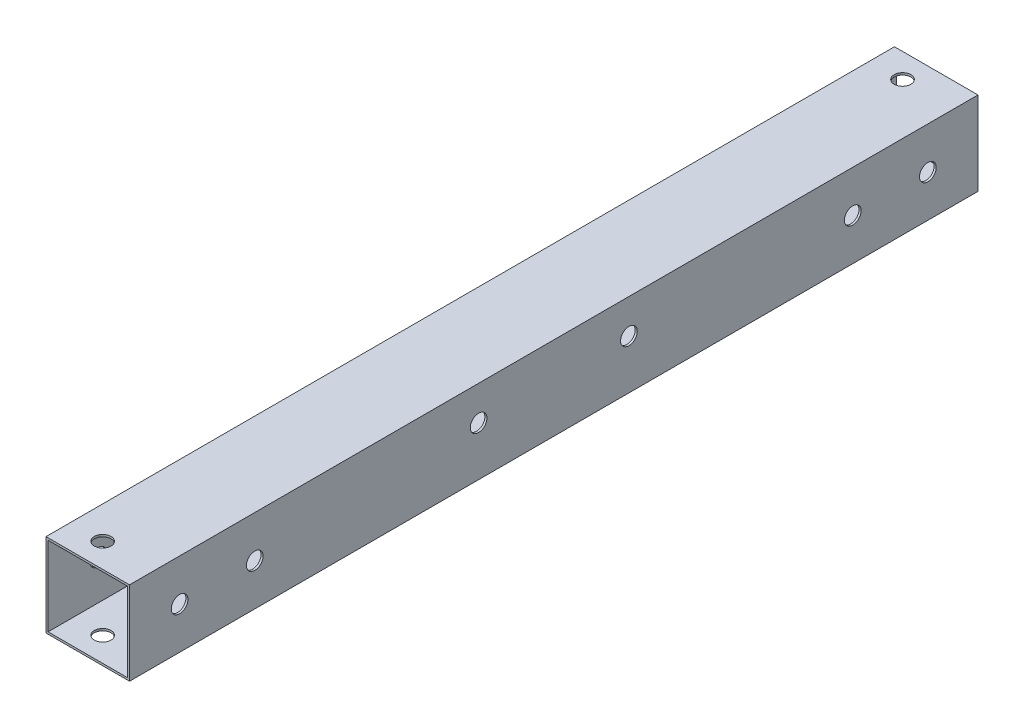
ISO-10303-21;
HEADER;
FILE_DESCRIPTION(('STEP AP214'),'2;1');
FILE_NAME('part.step','',(''),(''),'','','');
FILE_SCHEMA(('AUTOMOTIVE_DESIGN { 1 0 10303 214 1 1 1 1 }'));
ENDSEC;
DATA;
#1=APPLICATION_CONTEXT('core data for automotive mechanical design processes');
#2=APPLICATION_PROTOCOL_DEFINITION('international standard','automotive_design',2000,#1);
#3=PRODUCT_CONTEXT('',#1,'mechanical');
#4=PRODUCT('Part','Part','',(#3));
#5=PRODUCT_RELATED_PRODUCT_CATEGORY('part','',(#4));
#6=PRODUCT_DEFINITION_FORMATION('','',#4);
#7=PRODUCT_DEFINITION_CONTEXT('part definition',#1,'design');
#8=PRODUCT_DEFINITION('design','',#6,#7);
#9=PRODUCT_DEFINITION_SHAPE('','',#8);
#10=(LENGTH_UNIT() NAMED_UNIT(*) SI_UNIT(.MILLI.,.METRE.));
#11=(NAMED_UNIT(*) PLANE_ANGLE_UNIT() SI_UNIT($,.RADIAN.));
#12=(NAMED_UNIT(*) SI_UNIT($,.STERADIAN.) SOLID_ANGLE_UNIT());
#13=UNCERTAINTY_MEASURE_WITH_UNIT(LENGTH_MEASURE(1.E-05),#10,'distance_accuracy_value','');
#14=(GEOMETRIC_REPRESENTATION_CONTEXT(3) GLOBAL_UNCERTAINTY_ASSIGNED_CONTEXT((#13)) GLOBAL_UNIT_ASSIGNED_CONTEXT((#10,
#11,#12)) REPRESENTATION_CONTEXT('',''));
#15=CARTESIAN_POINT('',(0.,0.,0.));
#16=DIRECTION('',(0.,0.,1.));
#17=DIRECTION('',(1.,0.,0.));
#18=AXIS2_PLACEMENT_3D('',#15,#16,#17);
#19=CARTESIAN_POINT('',(10.,10.,-203.2));
#20=DIRECTION('',(1.,0.,0.));
#21=DIRECTION('',(0.,0.,-1.));
#22=AXIS2_PLACEMENT_3D('',#19,#20,#21);
#23=PLANE('',#22);
#24=CARTESIAN_POINT('',(10.,0.,-191.2));
#25=DIRECTION('',(-1.,0.,0.));
#26=DIRECTION('',(0.,-1.,0.));
#27=AXIS2_PLACEMENT_3D('',#24,#25,#26);
#28=CIRCLE('',#27,2.);
#29=CARTESIAN_POINT('',(10.,-1.99999999999999,-191.2));
#30=VERTEX_POINT('',#29);
#31=EDGE_CURVE('E171',#30,#30,#28,.T.);
#32=ORIENTED_EDGE('',*,*,#31,.T.);
#33=EDGE_LOOP('',(#32));
#34=FACE_BOUND('',#33,.T.);
#35=CARTESIAN_POINT('',(10.,0.,-30.));
#36=DIRECTION('',(-1.,0.,0.));
#37=DIRECTION('',(0.,-1.,0.));
#38=AXIS2_PLACEMENT_3D('',#35,#36,#37);
#39=CIRCLE('',#38,2.);
#40=CARTESIAN_POINT('',(10.,-2.,-30.));
#41=VERTEX_POINT('',#40);
#42=EDGE_CURVE('E221',#41,#41,#39,.T.);
#43=ORIENTED_EDGE('',*,*,#42,.T.);
#44=EDGE_LOOP('',(#43));
#45=FACE_BOUND('',#44,.T.);
#46=CARTESIAN_POINT('',(10.,1.79491039584504,-83.5999999999997));
#47=DIRECTION('',(-1.,0.,0.));
#48=DIRECTION('',(0.,-1.,0.));
#49=AXIS2_PLACEMENT_3D('',#46,#47,#48);
#50=CIRCLE('',#49,2.00000000000001);
#51=CARTESIAN_POINT('',(10.,-0.205089604154969,-83.5999999999997));
#52=VERTEX_POINT('',#51);
#53=EDGE_CURVE('E227',#52,#52,#50,.T.);
#54=ORIENTED_EDGE('',*,*,#53,.T.);
#55=EDGE_LOOP('',(#54));
#56=FACE_BOUND('',#55,.T.);
#57=CARTESIAN_POINT('',(10.,1.79491039584503,-119.6));
#58=DIRECTION('',(-1.,0.,0.));
#59=DIRECTION('',(0.,-1.,0.));
#60=AXIS2_PLACEMENT_3D('',#57,#58,#59);
#61=CIRCLE('',#60,2.);
#62=CARTESIAN_POINT('',(10.,-0.205089604154968,-119.6));
#63=VERTEX_POINT('',#62);
#64=EDGE_CURVE('E233',#63,#63,#61,.T.);
#65=ORIENTED_EDGE('',*,*,#64,.T.);
#66=EDGE_LOOP('',(#65));
#67=FACE_BOUND('',#66,.T.);
#68=CARTESIAN_POINT('',(10.,0.,-173.2));
#69=DIRECTION('',(-1.,0.,0.));
#70=DIRECTION('',(0.,-1.,0.));
#71=AXIS2_PLACEMENT_3D('',#68,#69,#70);
#72=CIRCLE('',#71,2.);
#73=CARTESIAN_POINT('',(10.,-1.99999999999999,-173.2));
#74=VERTEX_POINT('',#73);
#75=EDGE_CURVE('E239',#74,#74,#72,.T.);
#76=ORIENTED_EDGE('',*,*,#75,.T.);
#77=EDGE_LOOP('',(#76));
#78=FACE_BOUND('',#77,.T.);
#79=CARTESIAN_POINT('',(10.,0.,-12.));
#80=DIRECTION('',(-1.,0.,0.));
#81=DIRECTION('',(0.,-1.,0.));
#82=AXIS2_PLACEMENT_3D('',#79,#80,#81);
#83=CIRCLE('',#82,2.);
#84=CARTESIAN_POINT('',(10.,-1.99999999999999,-12.));
#85=VERTEX_POINT('',#84);
#86=EDGE_CURVE('E245',#85,#85,#83,.T.);
#87=ORIENTED_EDGE('',*,*,#86,.T.);
#88=EDGE_LOOP('',(#87));
#89=FACE_BOUND('',#88,.T.);
#90=DIRECTION('',(0.,1.,0.));
#91=VECTOR('',#90,1.);
#92=CARTESIAN_POINT('',(10.,10.,0.));
#93=LINE('',#92,#91);
#94=CARTESIAN_POINT('',(10.,-10.,0.));
#95=VERTEX_POINT('',#94);
#96=CARTESIAN_POINT('',(10.,10.,0.));
#97=VERTEX_POINT('',#96);
#98=EDGE_CURVE('E135',#95,#97,#93,.T.);
#99=ORIENTED_EDGE('',*,*,#98,.F.);
#100=DIRECTION('',(0.,0.,1.));
#101=VECTOR('',#100,1.);
#102=CARTESIAN_POINT('',(10.,-10.,-203.2));
#103=LINE('',#102,#101);
#104=CARTESIAN_POINT('',(10.,-10.,-203.2));
#105=VERTEX_POINT('',#104);
#106=EDGE_CURVE('E11',#105,#95,#103,.T.);
#107=ORIENTED_EDGE('',*,*,#106,.F.);
#108=DIRECTION('',(0.,1.,0.));
#109=VECTOR('',#108,1.);
#110=CARTESIAN_POINT('',(10.,10.,-203.2));
#111=LINE('',#110,#109);
#112=CARTESIAN_POINT('',(10.,10.,-203.2));
#113=VERTEX_POINT('',#112);
#114=EDGE_CURVE('E139',#105,#113,#111,.T.);
#115=ORIENTED_EDGE('',*,*,#114,.T.);
#116=DIRECTION('',(0.,0.,1.));
#117=VECTOR('',#116,1.);
#118=CARTESIAN_POINT('',(10.,10.,-203.2));
#119=LINE('',#118,#117);
#120=EDGE_CURVE('E152',#113,#97,#119,.T.);
#121=ORIENTED_EDGE('',*,*,#120,.T.);
#122=EDGE_LOOP('',(#99,#107,#115,#121));
#123=FACE_BOUND('',#122,.T.);
#124=ADVANCED_FACE('F34',(#34,#45,#56,#67,#78,#89,#123),#23,.T.);
#125=CARTESIAN_POINT('',(-10.,-10.,-203.2));
#126=DIRECTION('',(0.,-1.,0.));
#127=DIRECTION('',(0.,0.,-1.));
#128=AXIS2_PLACEMENT_3D('',#125,#126,#127);
#129=PLANE('',#128);
#130=CARTESIAN_POINT('',(-2.25,-10.,-197.37140771636));
#131=DIRECTION('',(0.,1.,0.));
#132=DIRECTION('',(0.,0.,1.));
#133=AXIS2_PLACEMENT_3D('',#130,#131,#132);
#134=CIRCLE('',#133,2.);
#135=CARTESIAN_POINT('',(-2.25,-10.,-195.37140771636));
#136=VERTEX_POINT('',#135);
#137=EDGE_CURVE('E193',#136,#136,#134,.T.);
#138=ORIENTED_EDGE('',*,*,#137,.T.);
#139=EDGE_LOOP('',(#138));
#140=FACE_BOUND('',#139,.T.);
#141=CARTESIAN_POINT('',(-2.25,-10.,-5.82859228363992));
#142=DIRECTION('',(0.,1.,0.));
#143=DIRECTION('',(0.,0.,1.));
#144=AXIS2_PLACEMENT_3D('',#141,#142,#143);
#145=CIRCLE('',#144,2.);
#146=CARTESIAN_POINT('',(-2.25,-10.,-3.82859228363992));
#147=VERTEX_POINT('',#146);
#148=EDGE_CURVE('E204',#147,#147,#145,.T.);
#149=ORIENTED_EDGE('',*,*,#148,.T.);
#150=EDGE_LOOP('',(#149));
#151=FACE_BOUND('',#150,.T.);
#152=DIRECTION('',(1.,0.,0.));
#153=VECTOR('',#152,1.);
#154=CARTESIAN_POINT('',(-10.,-10.,0.));
#155=LINE('',#154,#153);
#156=CARTESIAN_POINT('',(-10.,-10.,0.));
#157=VERTEX_POINT('',#156);
#158=EDGE_CURVE('E143',#157,#95,#155,.T.);
#159=ORIENTED_EDGE('',*,*,#158,.F.);
#160=DIRECTION('',(0.,0.,1.));
#161=VECTOR('',#160,1.);
#162=CARTESIAN_POINT('',(-10.,-10.,-203.2));
#163=LINE('',#162,#161);
#164=CARTESIAN_POINT('',(-10.,-10.,-203.2));
#165=VERTEX_POINT('',#164);
#166=EDGE_CURVE('E42',#165,#157,#163,.T.);
#167=ORIENTED_EDGE('',*,*,#166,.F.);
#168=DIRECTION('',(1.,0.,0.));
#169=VECTOR('',#168,1.);
#170=CARTESIAN_POINT('',(-10.,-10.,-203.2));
#171=LINE('',#170,#169);
#172=EDGE_CURVE('E149',#165,#105,#171,.T.);
#173=ORIENTED_EDGE('',*,*,#172,.T.);
#174=ORIENTED_EDGE('',*,*,#106,.T.);
#175=EDGE_LOOP('',(#159,#167,#173,#174));
#176=FACE_BOUND('',#175,.T.);
#177=ADVANCED_FACE('F284',(#140,#151,#176),#129,.T.);
#178=CARTESIAN_POINT('',(-10.,10.,-203.2));
#179=DIRECTION('',(-1.,0.,0.));
#180=DIRECTION('',(0.,-1.,0.));
#181=AXIS2_PLACEMENT_3D('',#178,#179,#180);
#182=PLANE('',#181);
#183=CARTESIAN_POINT('',(-10.,0.,-191.2));
#184=DIRECTION('',(-1.,0.,0.));
#185=DIRECTION('',(0.,-1.,0.));
#186=AXIS2_PLACEMENT_3D('',#183,#184,#185);
#187=CIRCLE('',#186,2.);
#188=CARTESIAN_POINT('',(-10.,-1.99999999999999,-191.2));
#189=VERTEX_POINT('',#188);
#190=EDGE_CURVE('E218',#189,#189,#187,.T.);
#191=ORIENTED_EDGE('',*,*,#190,.F.);
#192=EDGE_LOOP('',(#191));
#193=FACE_BOUND('',#192,.T.);
#194=CARTESIAN_POINT('',(-10.,0.,-30.));
#195=DIRECTION('',(-1.,0.,0.));
#196=DIRECTION('',(0.,-1.,0.));
#197=AXIS2_PLACEMENT_3D('',#194,#195,#196);
#198=CIRCLE('',#197,2.);
#199=CARTESIAN_POINT('',(-10.,-2.,-30.));
#200=VERTEX_POINT('',#199);
#201=EDGE_CURVE('E224',#200,#200,#198,.T.);
#202=ORIENTED_EDGE('',*,*,#201,.F.);
#203=EDGE_LOOP('',(#202));
#204=FACE_BOUND('',#203,.T.);
#205=CARTESIAN_POINT('',(-10.,1.79491039584504,-83.5999999999997));
#206=DIRECTION('',(-1.,0.,0.));
#207=DIRECTION('',(0.,-1.,0.));
#208=AXIS2_PLACEMENT_3D('',#205,#206,#207);
#209=CIRCLE('',#208,2.00000000000001);
#210=CARTESIAN_POINT('',(-10.,-0.205089604154971,-83.5999999999997));
#211=VERTEX_POINT('',#210);
#212=EDGE_CURVE('E230',#211,#211,#209,.T.);
#213=ORIENTED_EDGE('',*,*,#212,.F.);
#214=EDGE_LOOP('',(#213));
#215=FACE_BOUND('',#214,.T.);
#216=CARTESIAN_POINT('',(-10.,1.79491039584503,-119.6));
#217=DIRECTION('',(-1.,0.,0.));
#218=DIRECTION('',(0.,-1.,0.));
#219=AXIS2_PLACEMENT_3D('',#216,#217,#218);
#220=CIRCLE('',#219,2.);
#221=CARTESIAN_POINT('',(-10.,-0.20508960415497,-119.6));
#222=VERTEX_POINT('',#221);
#223=EDGE_CURVE('E236',#222,#222,#220,.T.);
#224=ORIENTED_EDGE('',*,*,#223,.F.);
#225=EDGE_LOOP('',(#224));
#226=FACE_BOUND('',#225,.T.);
#227=CARTESIAN_POINT('',(-10.,0.,-173.2));
#228=DIRECTION('',(-1.,0.,0.));
#229=DIRECTION('',(0.,-1.,0.));
#230=AXIS2_PLACEMENT_3D('',#227,#228,#229);
#231=CIRCLE('',#230,2.);
#232=CARTESIAN_POINT('',(-10.,-1.99999999999999,-173.2));
#233=VERTEX_POINT('',#232);
#234=EDGE_CURVE('E242',#233,#233,#231,.T.);
#235=ORIENTED_EDGE('',*,*,#234,.F.);
#236=EDGE_LOOP('',(#235));
#237=FACE_BOUND('',#236,.T.);
#238=CARTESIAN_POINT('',(-10.,0.,-12.));
#239=DIRECTION('',(-1.,0.,0.));
#240=DIRECTION('',(0.,-1.,0.));
#241=AXIS2_PLACEMENT_3D('',#238,#239,#240);
#242=CIRCLE('',#241,2.);
#243=CARTESIAN_POINT('',(-10.,-1.99999999999999,-12.));
#244=VERTEX_POINT('',#243);
#245=EDGE_CURVE('E215',#244,#244,#242,.T.);
#246=ORIENTED_EDGE('',*,*,#245,.F.);
#247=EDGE_LOOP('',(#246));
#248=FACE_BOUND('',#247,.T.);
#249=DIRECTION('',(0.,-1.,0.));
#250=VECTOR('',#249,1.);
#251=CARTESIAN_POINT('',(-10.,10.,0.));
#252=LINE('',#251,#250);
#253=CARTESIAN_POINT('',(-10.,10.,0.));
#254=VERTEX_POINT('',#253);
#255=EDGE_CURVE('E158',#254,#157,#252,.T.);
#256=ORIENTED_EDGE('',*,*,#255,.F.);
#257=DIRECTION('',(0.,0.,1.));
#258=VECTOR('',#257,1.);
#259=CARTESIAN_POINT('',(-10.,10.,-203.2));
#260=LINE('',#259,#258);
#261=CARTESIAN_POINT('',(-10.,10.,-203.2));
#262=VERTEX_POINT('',#261);
#263=EDGE_CURVE('E164',#262,#254,#260,.T.);
#264=ORIENTED_EDGE('',*,*,#263,.F.);
#265=DIRECTION('',(0.,-1.,0.));
#266=VECTOR('',#265,1.);
#267=CARTESIAN_POINT('',(-10.,10.,-203.2));
#268=LINE('',#267,#266);
#269=EDGE_CURVE('E146',#262,#165,#268,.T.);
#270=ORIENTED_EDGE('',*,*,#269,.T.);
#271=ORIENTED_EDGE('',*,*,#166,.T.);
#272=EDGE_LOOP('',(#256,#264,#270,#271));
#273=FACE_BOUND('',#272,.T.);
#274=ADVANCED_FACE('F289',(#193,#204,#215,#226,#237,#248,#273),#182,.T.);
#275=CARTESIAN_POINT('',(-10.,10.,-203.2));
#276=DIRECTION('',(0.,1.,0.));
#277=DIRECTION('',(0.,0.,1.));
#278=AXIS2_PLACEMENT_3D('',#275,#276,#277);
#279=PLANE('',#278);
#280=CARTESIAN_POINT('',(-2.25,10.,-197.37140771636));
#281=DIRECTION('',(0.,1.,0.));
#282=DIRECTION('',(0.,0.,1.));
#283=AXIS2_PLACEMENT_3D('',#280,#281,#282);
#284=CIRCLE('',#283,2.);
#285=CARTESIAN_POINT('',(-2.25,10.,-195.37140771636));
#286=VERTEX_POINT('',#285);
#287=EDGE_CURVE('E199',#286,#286,#284,.T.);
#288=ORIENTED_EDGE('',*,*,#287,.F.);
#289=EDGE_LOOP('',(#288));
#290=FACE_BOUND('',#289,.T.);
#291=CARTESIAN_POINT('',(-2.25,10.,-5.82859228363992));
#292=DIRECTION('',(0.,1.,0.));
#293=DIRECTION('',(0.,0.,1.));
#294=AXIS2_PLACEMENT_3D('',#291,#292,#293);
#295=CIRCLE('',#294,2.);
#296=CARTESIAN_POINT('',(-2.25,10.,-3.82859228363992));
#297=VERTEX_POINT('',#296);
#298=EDGE_CURVE('E209',#297,#297,#295,.T.);
#299=ORIENTED_EDGE('',*,*,#298,.F.);
#300=EDGE_LOOP('',(#299));
#301=FACE_BOUND('',#300,.T.);
#302=DIRECTION('',(-1.,0.,0.));
#303=VECTOR('',#302,1.);
#304=CARTESIAN_POINT('',(-10.,10.,0.));
#305=LINE('',#304,#303);
#306=EDGE_CURVE('E155',#97,#254,#305,.T.);
#307=ORIENTED_EDGE('',*,*,#306,.F.);
#308=ORIENTED_EDGE('',*,*,#120,.F.);
#309=DIRECTION('',(-1.,0.,0.));
#310=VECTOR('',#309,1.);
#311=CARTESIAN_POINT('',(-10.,10.,-203.2));
#312=LINE('',#311,#310);
#313=EDGE_CURVE('E142',#113,#262,#312,.T.);
#314=ORIENTED_EDGE('',*,*,#313,.T.);
#315=ORIENTED_EDGE('',*,*,#263,.T.);
#316=EDGE_LOOP('',(#307,#308,#314,#315));
#317=FACE_BOUND('',#316,.T.);
#318=ADVANCED_FACE('F315',(#290,#301,#317),#279,.T.);
#319=CARTESIAN_POINT('',(0.,0.,-203.2));
#320=DIRECTION('',(0.,0.,1.));
#321=DIRECTION('',(1.,0.,0.));
#322=AXIS2_PLACEMENT_3D('',#319,#320,#321);
#323=PLANE('',#322);
#324=DIRECTION('',(-1.,0.,0.));
#325=VECTOR('',#324,1.);
#326=CARTESIAN_POINT('',(9.5,9.5,-203.2));
#327=LINE('',#326,#325);
#328=CARTESIAN_POINT('',(9.5,9.5,-203.2));
#329=VERTEX_POINT('',#328);
#330=CARTESIAN_POINT('',(-9.5,9.5,-203.2));
#331=VERTEX_POINT('',#330);
#332=EDGE_CURVE('E107',#329,#331,#327,.T.);
#333=ORIENTED_EDGE('',*,*,#332,.T.);
#334=DIRECTION('',(0.,-1.,0.));
#335=VECTOR('',#334,1.);
#336=CARTESIAN_POINT('',(-9.5,-9.5,-203.2));
#337=LINE('',#336,#335);
#338=CARTESIAN_POINT('',(-9.5,-9.5,-203.2));
#339=VERTEX_POINT('',#338);
#340=EDGE_CURVE('E101',#331,#339,#337,.T.);
#341=ORIENTED_EDGE('',*,*,#340,.T.);
#342=DIRECTION('',(1.,0.,0.));
#343=VECTOR('',#342,1.);
#344=CARTESIAN_POINT('',(9.5,-9.5,-203.2));
#345=LINE('',#344,#343);
#346=CARTESIAN_POINT('',(9.5,-9.5,-203.2));
#347=VERTEX_POINT('',#346);
#348=EDGE_CURVE('E110',#339,#347,#345,.T.);
#349=ORIENTED_EDGE('',*,*,#348,.T.);
#350=DIRECTION('',(0.,1.,0.));
#351=VECTOR('',#350,1.);
#352=CARTESIAN_POINT('',(9.5,-9.5,-203.2));
#353=LINE('',#352,#351);
#354=EDGE_CURVE('E50',#347,#329,#353,.T.);
#355=ORIENTED_EDGE('',*,*,#354,.T.);
#356=EDGE_LOOP('',(#333,#341,#349,#355));
#357=FACE_BOUND('',#356,.T.);
#358=ORIENTED_EDGE('',*,*,#114,.F.);
#359=ORIENTED_EDGE('',*,*,#172,.F.);
#360=ORIENTED_EDGE('',*,*,#269,.F.);
#361=ORIENTED_EDGE('',*,*,#313,.F.);
#362=EDGE_LOOP('',(#358,#359,#360,#361));
#363=FACE_BOUND('',#362,.T.);
#364=ADVANCED_FACE('F114',(#357,#363),#323,.F.);
#365=CARTESIAN_POINT('',(0.,0.,0.));
#366=DIRECTION('',(0.,0.,1.));
#367=DIRECTION('',(1.,0.,0.));
#368=AXIS2_PLACEMENT_3D('',#365,#366,#367);
#369=PLANE('',#368);
#370=DIRECTION('',(0.,-1.,0.));
#371=VECTOR('',#370,1.);
#372=CARTESIAN_POINT('',(-9.5,-9.5,0.));
#373=LINE('',#372,#371);
#374=CARTESIAN_POINT('',(-9.5,9.5,0.));
#375=VERTEX_POINT('',#374);
#376=CARTESIAN_POINT('',(-9.5,-9.5,0.));
#377=VERTEX_POINT('',#376);
#378=EDGE_CURVE('E58',#375,#377,#373,.T.);
#379=ORIENTED_EDGE('',*,*,#378,.F.);
#380=DIRECTION('',(-1.,0.,0.));
#381=VECTOR('',#380,1.);
#382=CARTESIAN_POINT('',(9.5,9.5,0.));
#383=LINE('',#382,#381);
#384=CARTESIAN_POINT('',(9.5,9.5,0.));
#385=VERTEX_POINT('',#384);
#386=EDGE_CURVE('E117',#385,#375,#383,.T.);
#387=ORIENTED_EDGE('',*,*,#386,.F.);
#388=DIRECTION('',(0.,1.,0.));
#389=VECTOR('',#388,1.);
#390=CARTESIAN_POINT('',(9.5,-9.5,0.));
#391=LINE('',#390,#389);
#392=CARTESIAN_POINT('',(9.5,-9.5,0.));
#393=VERTEX_POINT('',#392);
#394=EDGE_CURVE('E120',#393,#385,#391,.T.);
#395=ORIENTED_EDGE('',*,*,#394,.F.);
#396=DIRECTION('',(1.,0.,0.));
#397=VECTOR('',#396,1.);
#398=CARTESIAN_POINT('',(9.5,-9.5,0.));
#399=LINE('',#398,#397);
#400=EDGE_CURVE('E129',#377,#393,#399,.T.);
#401=ORIENTED_EDGE('',*,*,#400,.F.);
#402=EDGE_LOOP('',(#379,#387,#395,#401));
#403=FACE_BOUND('',#402,.T.);
#404=ORIENTED_EDGE('',*,*,#98,.T.);
#405=ORIENTED_EDGE('',*,*,#306,.T.);
#406=ORIENTED_EDGE('',*,*,#255,.T.);
#407=ORIENTED_EDGE('',*,*,#158,.T.);
#408=EDGE_LOOP('',(#404,#405,#406,#407));
#409=FACE_BOUND('',#408,.T.);
#410=ADVANCED_FACE('F308',(#403,#409),#369,.T.);
#411=CARTESIAN_POINT('',(-9.5,-9.5,-203.2));
#412=DIRECTION('',(-1.,0.,0.));
#413=DIRECTION('',(0.,0.,1.));
#414=AXIS2_PLACEMENT_3D('',#411,#412,#413);
#415=PLANE('',#414);
#416=CARTESIAN_POINT('',(-9.5,0.,-191.2));
#417=DIRECTION('',(-1.,0.,0.));
#418=DIRECTION('',(0.,0.,1.));
#419=AXIS2_PLACEMENT_3D('',#416,#417,#418);
#420=CIRCLE('',#419,2.);
#421=CARTESIAN_POINT('',(-9.5,0.,-189.2));
#422=VERTEX_POINT('',#421);
#423=EDGE_CURVE('E123',#422,#422,#420,.T.);
#424=ORIENTED_EDGE('',*,*,#423,.T.);
#425=EDGE_LOOP('',(#424));
#426=FACE_BOUND('',#425,.T.);
#427=CARTESIAN_POINT('',(-9.5,0.,-30.));
#428=DIRECTION('',(-1.,0.,0.));
#429=DIRECTION('',(0.,0.,1.));
#430=AXIS2_PLACEMENT_3D('',#427,#428,#429);
#431=CIRCLE('',#430,2.);
#432=CARTESIAN_POINT('',(-9.5,0.,-28.));
#433=VERTEX_POINT('',#432);
#434=EDGE_CURVE('E187',#433,#433,#431,.T.);
#435=ORIENTED_EDGE('',*,*,#434,.T.);
#436=EDGE_LOOP('',(#435));
#437=FACE_BOUND('',#436,.T.);
#438=CARTESIAN_POINT('',(-9.5,1.79491039584504,-83.5999999999997));
#439=DIRECTION('',(-1.,0.,0.));
#440=DIRECTION('',(0.,0.,1.));
#441=AXIS2_PLACEMENT_3D('',#438,#439,#440);
#442=CIRCLE('',#441,2.00000000000001);
#443=CARTESIAN_POINT('',(-9.5,1.79491039584504,-81.5999999999997));
#444=VERTEX_POINT('',#443);
#445=EDGE_CURVE('E183',#444,#444,#442,.T.);
#446=ORIENTED_EDGE('',*,*,#445,.T.);
#447=EDGE_LOOP('',(#446));
#448=FACE_BOUND('',#447,.T.);
#449=CARTESIAN_POINT('',(-9.5,1.79491039584503,-119.6));
#450=DIRECTION('',(-1.,0.,0.));
#451=DIRECTION('',(0.,0.,1.));
#452=AXIS2_PLACEMENT_3D('',#449,#450,#451);
#453=CIRCLE('',#452,2.);
#454=CARTESIAN_POINT('',(-9.5,1.79491039584503,-117.6));
#455=VERTEX_POINT('',#454);
#456=EDGE_CURVE('E179',#455,#455,#453,.T.);
#457=ORIENTED_EDGE('',*,*,#456,.T.);
#458=EDGE_LOOP('',(#457));
#459=FACE_BOUND('',#458,.T.);
#460=CARTESIAN_POINT('',(-9.5,0.,-173.2));
#461=DIRECTION('',(-1.,0.,0.));
#462=DIRECTION('',(0.,0.,1.));
#463=AXIS2_PLACEMENT_3D('',#460,#461,#462);
#464=CIRCLE('',#463,2.);
#465=CARTESIAN_POINT('',(-9.5,0.,-171.2));
#466=VERTEX_POINT('',#465);
#467=EDGE_CURVE('E175',#466,#466,#464,.T.);
#468=ORIENTED_EDGE('',*,*,#467,.T.);
#469=EDGE_LOOP('',(#468));
#470=FACE_BOUND('',#469,.T.);
#471=CARTESIAN_POINT('',(-9.5,0.,-12.));
#472=DIRECTION('',(-1.,0.,0.));
#473=DIRECTION('',(0.,0.,1.));
#474=AXIS2_PLACEMENT_3D('',#471,#472,#473);
#475=CIRCLE('',#474,2.);
#476=CARTESIAN_POINT('',(-9.5,0.,-10.));
#477=VERTEX_POINT('',#476);
#478=EDGE_CURVE('E170',#477,#477,#475,.T.);
#479=ORIENTED_EDGE('',*,*,#478,.T.);
#480=EDGE_LOOP('',(#479));
#481=FACE_BOUND('',#480,.T.);
#482=ORIENTED_EDGE('',*,*,#378,.T.);
#483=DIRECTION('',(0.,0.,1.));
#484=VECTOR('',#483,1.);
#485=CARTESIAN_POINT('',(-9.5,-9.5,-203.2));
#486=LINE('',#485,#484);
#487=EDGE_CURVE('E97',#339,#377,#486,.T.);
#488=ORIENTED_EDGE('',*,*,#487,.F.);
#489=ORIENTED_EDGE('',*,*,#340,.F.);
#490=DIRECTION('',(0.,0.,1.));
#491=VECTOR('',#490,1.);
#492=CARTESIAN_POINT('',(-9.5,9.5,-203.2));
#493=LINE('',#492,#491);
#494=EDGE_CURVE('E133',#331,#375,#493,.T.);
#495=ORIENTED_EDGE('',*,*,#494,.T.);
#496=EDGE_LOOP('',(#482,#488,#489,#495));
#497=FACE_BOUND('',#496,.T.);
#498=ADVANCED_FACE('F99',(#426,#437,#448,#459,#470,#481,#497),#415,.F.);
#499=CARTESIAN_POINT('',(9.5,9.5,-203.2));
#500=DIRECTION('',(0.,1.,0.));
#501=DIRECTION('',(-1.,0.,0.));
#502=AXIS2_PLACEMENT_3D('',#499,#500,#501);
#503=PLANE('',#502);
#504=CARTESIAN_POINT('',(-2.25,9.5,-197.37140771636));
#505=DIRECTION('',(0.,1.,0.));
#506=DIRECTION('',(-1.,0.,0.));
#507=AXIS2_PLACEMENT_3D('',#504,#505,#506);
#508=CIRCLE('',#507,2.);
#509=CARTESIAN_POINT('',(-4.25,9.5,-197.37140771636));
#510=VERTEX_POINT('',#509);
#511=EDGE_CURVE('E212',#510,#510,#508,.T.);
#512=ORIENTED_EDGE('',*,*,#511,.T.);
#513=EDGE_LOOP('',(#512));
#514=FACE_BOUND('',#513,.T.);
#515=CARTESIAN_POINT('',(-2.25,9.5,-5.82859228363992));
#516=DIRECTION('',(0.,1.,0.));
#517=DIRECTION('',(-1.,0.,0.));
#518=AXIS2_PLACEMENT_3D('',#515,#516,#517);
#519=CIRCLE('',#518,2.);
#520=CARTESIAN_POINT('',(-4.25,9.5,-5.82859228363992));
#521=VERTEX_POINT('',#520);
#522=EDGE_CURVE('E192',#521,#521,#519,.T.);
#523=ORIENTED_EDGE('',*,*,#522,.T.);
#524=EDGE_LOOP('',(#523));
#525=FACE_BOUND('',#524,.T.);
#526=ORIENTED_EDGE('',*,*,#386,.T.);
#527=ORIENTED_EDGE('',*,*,#494,.F.);
#528=ORIENTED_EDGE('',*,*,#332,.F.);
#529=DIRECTION('',(0.,0.,1.));
#530=VECTOR('',#529,1.);
#531=CARTESIAN_POINT('',(9.5,9.5,-203.2));
#532=LINE('',#531,#530);
#533=EDGE_CURVE('E136',#329,#385,#532,.T.);
#534=ORIENTED_EDGE('',*,*,#533,.T.);
#535=EDGE_LOOP('',(#526,#527,#528,#534));
#536=FACE_BOUND('',#535,.T.);
#537=ADVANCED_FACE('F334',(#514,#525,#536),#503,.F.);
#538=CARTESIAN_POINT('',(9.5,-9.5,-203.2));
#539=DIRECTION('',(1.,0.,0.));
#540=DIRECTION('',(0.,0.,-1.));
#541=AXIS2_PLACEMENT_3D('',#538,#539,#540);
#542=PLANE('',#541);
#543=CARTESIAN_POINT('',(9.5,0.,-191.2));
#544=DIRECTION('',(1.,0.,0.));
#545=DIRECTION('',(0.,0.,-1.));
#546=AXIS2_PLACEMENT_3D('',#543,#544,#545);
#547=CIRCLE('',#546,2.);
#548=CARTESIAN_POINT('',(9.5,0.,-193.2));
#549=VERTEX_POINT('',#548);
#550=EDGE_CURVE('E188',#549,#549,#547,.T.);
#551=ORIENTED_EDGE('',*,*,#550,.T.);
#552=EDGE_LOOP('',(#551));
#553=FACE_BOUND('',#552,.T.);
#554=CARTESIAN_POINT('',(9.5,0.,-30.));
#555=DIRECTION('',(1.,0.,0.));
#556=DIRECTION('',(0.,0.,-1.));
#557=AXIS2_PLACEMENT_3D('',#554,#555,#556);
#558=CIRCLE('',#557,2.);
#559=CARTESIAN_POINT('',(9.5,0.,-32.));
#560=VERTEX_POINT('',#559);
#561=EDGE_CURVE('E184',#560,#560,#558,.T.);
#562=ORIENTED_EDGE('',*,*,#561,.T.);
#563=EDGE_LOOP('',(#562));
#564=FACE_BOUND('',#563,.T.);
#565=CARTESIAN_POINT('',(9.5,1.79491039584504,-83.5999999999997));
#566=DIRECTION('',(1.,0.,0.));
#567=DIRECTION('',(0.,0.,-1.));
#568=AXIS2_PLACEMENT_3D('',#565,#566,#567);
#569=CIRCLE('',#568,2.00000000000001);
#570=CARTESIAN_POINT('',(9.5,1.79491039584504,-85.5999999999997));
#571=VERTEX_POINT('',#570);
#572=EDGE_CURVE('E180',#571,#571,#569,.T.);
#573=ORIENTED_EDGE('',*,*,#572,.T.);
#574=EDGE_LOOP('',(#573));
#575=FACE_BOUND('',#574,.T.);
#576=CARTESIAN_POINT('',(9.5,1.79491039584503,-119.6));
#577=DIRECTION('',(1.,0.,0.));
#578=DIRECTION('',(0.,0.,-1.));
#579=AXIS2_PLACEMENT_3D('',#576,#577,#578);
#580=CIRCLE('',#579,2.);
#581=CARTESIAN_POINT('',(9.5,1.79491039584503,-121.6));
#582=VERTEX_POINT('',#581);
#583=EDGE_CURVE('E176',#582,#582,#580,.T.);
#584=ORIENTED_EDGE('',*,*,#583,.T.);
#585=EDGE_LOOP('',(#584));
#586=FACE_BOUND('',#585,.T.);
#587=CARTESIAN_POINT('',(9.5,0.,-173.2));
#588=DIRECTION('',(1.,0.,0.));
#589=DIRECTION('',(0.,0.,-1.));
#590=AXIS2_PLACEMENT_3D('',#587,#588,#589);
#591=CIRCLE('',#590,2.);
#592=CARTESIAN_POINT('',(9.5,0.,-175.2));
#593=VERTEX_POINT('',#592);
#594=EDGE_CURVE('E172',#593,#593,#591,.T.);
#595=ORIENTED_EDGE('',*,*,#594,.T.);
#596=EDGE_LOOP('',(#595));
#597=FACE_BOUND('',#596,.T.);
#598=CARTESIAN_POINT('',(9.5,0.,-12.));
#599=DIRECTION('',(1.,0.,0.));
#600=DIRECTION('',(0.,0.,-1.));
#601=AXIS2_PLACEMENT_3D('',#598,#599,#600);
#602=CIRCLE('',#601,2.);
#603=CARTESIAN_POINT('',(9.5,0.,-14.));
#604=VERTEX_POINT('',#603);
#605=EDGE_CURVE('E167',#604,#604,#602,.T.);
#606=ORIENTED_EDGE('',*,*,#605,.T.);
#607=EDGE_LOOP('',(#606));
#608=FACE_BOUND('',#607,.T.);
#609=ORIENTED_EDGE('',*,*,#394,.T.);
#610=ORIENTED_EDGE('',*,*,#533,.F.);
#611=ORIENTED_EDGE('',*,*,#354,.F.);
#612=DIRECTION('',(0.,0.,1.));
#613=VECTOR('',#612,1.);
#614=CARTESIAN_POINT('',(9.5,-9.5,-203.2));
#615=LINE('',#614,#613);
#616=EDGE_CURVE('E106',#347,#393,#615,.T.);
#617=ORIENTED_EDGE('',*,*,#616,.T.);
#618=EDGE_LOOP('',(#609,#610,#611,#617));
#619=FACE_BOUND('',#618,.T.);
#620=ADVANCED_FACE('F339',(#553,#564,#575,#586,#597,#608,#619),#542,.F.);
#621=CARTESIAN_POINT('',(9.5,-9.5,-203.2));
#622=DIRECTION('',(0.,-1.,0.));
#623=DIRECTION('',(1.,0.,0.));
#624=AXIS2_PLACEMENT_3D('',#621,#622,#623);
#625=PLANE('',#624);
#626=CARTESIAN_POINT('',(-2.25,-9.5,-197.37140771636));
#627=DIRECTION('',(0.,-1.,0.));
#628=DIRECTION('',(1.,0.,0.));
#629=AXIS2_PLACEMENT_3D('',#626,#627,#628);
#630=CIRCLE('',#629,2.);
#631=CARTESIAN_POINT('',(-0.249999999999998,-9.5,-197.37140771636));
#632=VERTEX_POINT('',#631);
#633=EDGE_CURVE('E37',#632,#632,#630,.T.);
#634=ORIENTED_EDGE('',*,*,#633,.T.);
#635=EDGE_LOOP('',(#634));
#636=FACE_BOUND('',#635,.T.);
#637=CARTESIAN_POINT('',(-2.25,-9.5,-5.82859228363992));
#638=DIRECTION('',(0.,-1.,0.));
#639=DIRECTION('',(1.,0.,0.));
#640=AXIS2_PLACEMENT_3D('',#637,#638,#639);
#641=CIRCLE('',#640,2.);
#642=CARTESIAN_POINT('',(-0.249999999999999,-9.5,-5.82859228363992));
#643=VERTEX_POINT('',#642);
#644=EDGE_CURVE('E190',#643,#643,#641,.T.);
#645=ORIENTED_EDGE('',*,*,#644,.T.);
#646=EDGE_LOOP('',(#645));
#647=FACE_BOUND('',#646,.T.);
#648=ORIENTED_EDGE('',*,*,#400,.T.);
#649=ORIENTED_EDGE('',*,*,#616,.F.);
#650=ORIENTED_EDGE('',*,*,#348,.F.);
#651=ORIENTED_EDGE('',*,*,#487,.T.);
#652=EDGE_LOOP('',(#648,#649,#650,#651));
#653=FACE_BOUND('',#652,.T.);
#654=ADVANCED_FACE('F111',(#636,#647,#653),#625,.F.);
#655=CARTESIAN_POINT('',(10.,0.,-12.));
#656=DIRECTION('',(-1.,0.,0.));
#657=DIRECTION('',(0.,-1.,0.));
#658=AXIS2_PLACEMENT_3D('',#655,#656,#657);
#659=CYLINDRICAL_SURFACE('',#658,2.);
#660=ORIENTED_EDGE('',*,*,#86,.F.);
#661=EDGE_LOOP('',(#660));
#662=FACE_BOUND('',#661,.T.);
#663=ORIENTED_EDGE('',*,*,#605,.F.);
#664=EDGE_LOOP('',(#663));
#665=FACE_BOUND('',#664,.T.);
#666=ADVANCED_FACE('F338',(#662,#665),#659,.F.);
#667=CARTESIAN_POINT('',(10.,0.,-173.2));
#668=DIRECTION('',(-1.,0.,0.));
#669=DIRECTION('',(0.,-1.,0.));
#670=AXIS2_PLACEMENT_3D('',#667,#668,#669);
#671=CYLINDRICAL_SURFACE('',#670,2.);
#672=ORIENTED_EDGE('',*,*,#75,.F.);
#673=EDGE_LOOP('',(#672));
#674=FACE_BOUND('',#673,.T.);
#675=ORIENTED_EDGE('',*,*,#594,.F.);
#676=EDGE_LOOP('',(#675));
#677=FACE_BOUND('',#676,.T.);
#678=ADVANCED_FACE('F355',(#674,#677),#671,.F.);
#679=CARTESIAN_POINT('',(10.,1.79491039584503,-119.6));
#680=DIRECTION('',(-1.,0.,0.));
#681=DIRECTION('',(0.,-1.,0.));
#682=AXIS2_PLACEMENT_3D('',#679,#680,#681);
#683=CYLINDRICAL_SURFACE('',#682,2.);
#684=ORIENTED_EDGE('',*,*,#64,.F.);
#685=EDGE_LOOP('',(#684));
#686=FACE_BOUND('',#685,.T.);
#687=ORIENTED_EDGE('',*,*,#583,.F.);
#688=EDGE_LOOP('',(#687));
#689=FACE_BOUND('',#688,.T.);
#690=ADVANCED_FACE('F358',(#686,#689),#683,.F.);
#691=CARTESIAN_POINT('',(10.,1.79491039584504,-83.5999999999997));
#692=DIRECTION('',(-1.,0.,0.));
#693=DIRECTION('',(0.,-1.,0.));
#694=AXIS2_PLACEMENT_3D('',#691,#692,#693);
#695=CYLINDRICAL_SURFACE('',#694,2.00000000000001);
#696=ORIENTED_EDGE('',*,*,#53,.F.);
#697=EDGE_LOOP('',(#696));
#698=FACE_BOUND('',#697,.T.);
#699=ORIENTED_EDGE('',*,*,#572,.F.);
#700=EDGE_LOOP('',(#699));
#701=FACE_BOUND('',#700,.T.);
#702=ADVANCED_FACE('F280',(#698,#701),#695,.F.);
#703=CARTESIAN_POINT('',(10.,0.,-30.));
#704=DIRECTION('',(-1.,0.,0.));
#705=DIRECTION('',(0.,-1.,0.));
#706=AXIS2_PLACEMENT_3D('',#703,#704,#705);
#707=CYLINDRICAL_SURFACE('',#706,2.);
#708=ORIENTED_EDGE('',*,*,#42,.F.);
#709=EDGE_LOOP('',(#708));
#710=FACE_BOUND('',#709,.T.);
#711=ORIENTED_EDGE('',*,*,#561,.F.);
#712=EDGE_LOOP('',(#711));
#713=FACE_BOUND('',#712,.T.);
#714=ADVANCED_FACE('F268',(#710,#713),#707,.F.);
#715=CARTESIAN_POINT('',(10.,0.,-191.2));
#716=DIRECTION('',(-1.,0.,0.));
#717=DIRECTION('',(0.,-1.,0.));
#718=AXIS2_PLACEMENT_3D('',#715,#716,#717);
#719=CYLINDRICAL_SURFACE('',#718,2.);
#720=ORIENTED_EDGE('',*,*,#31,.F.);
#721=EDGE_LOOP('',(#720));
#722=FACE_BOUND('',#721,.T.);
#723=ORIENTED_EDGE('',*,*,#550,.F.);
#724=EDGE_LOOP('',(#723));
#725=FACE_BOUND('',#724,.T.);
#726=ADVANCED_FACE('F276',(#722,#725),#719,.F.);
#727=ORIENTED_EDGE('',*,*,#245,.T.);
#728=EDGE_LOOP('',(#727));
#729=FACE_BOUND('',#728,.T.);
#730=ORIENTED_EDGE('',*,*,#478,.F.);
#731=EDGE_LOOP('',(#730));
#732=FACE_BOUND('',#731,.T.);
#733=ADVANCED_FACE('F347',(#729,#732),#659,.F.);
#734=ORIENTED_EDGE('',*,*,#234,.T.);
#735=EDGE_LOOP('',(#734));
#736=FACE_BOUND('',#735,.T.);
#737=ORIENTED_EDGE('',*,*,#467,.F.);
#738=EDGE_LOOP('',(#737));
#739=FACE_BOUND('',#738,.T.);
#740=ADVANCED_FACE('F350',(#736,#739),#671,.F.);
#741=ORIENTED_EDGE('',*,*,#223,.T.);
#742=EDGE_LOOP('',(#741));
#743=FACE_BOUND('',#742,.T.);
#744=ORIENTED_EDGE('',*,*,#456,.F.);
#745=EDGE_LOOP('',(#744));
#746=FACE_BOUND('',#745,.T.);
#747=ADVANCED_FACE('F277',(#743,#746),#683,.F.);
#748=ORIENTED_EDGE('',*,*,#212,.T.);
#749=EDGE_LOOP('',(#748));
#750=FACE_BOUND('',#749,.T.);
#751=ORIENTED_EDGE('',*,*,#445,.F.);
#752=EDGE_LOOP('',(#751));
#753=FACE_BOUND('',#752,.T.);
#754=ADVANCED_FACE('F265',(#750,#753),#695,.F.);
#755=ORIENTED_EDGE('',*,*,#201,.T.);
#756=EDGE_LOOP('',(#755));
#757=FACE_BOUND('',#756,.T.);
#758=ORIENTED_EDGE('',*,*,#434,.F.);
#759=EDGE_LOOP('',(#758));
#760=FACE_BOUND('',#759,.T.);
#761=ADVANCED_FACE('F262',(#757,#760),#707,.F.);
#762=ORIENTED_EDGE('',*,*,#190,.T.);
#763=EDGE_LOOP('',(#762));
#764=FACE_BOUND('',#763,.T.);
#765=ORIENTED_EDGE('',*,*,#423,.F.);
#766=EDGE_LOOP('',(#765));
#767=FACE_BOUND('',#766,.T.);
#768=ADVANCED_FACE('F264',(#764,#767),#719,.F.);
#769=CARTESIAN_POINT('',(-2.25,-10.,-5.82859228363992));
#770=DIRECTION('',(0.,1.,0.));
#771=DIRECTION('',(0.,0.,1.));
#772=AXIS2_PLACEMENT_3D('',#769,#770,#771);
#773=CYLINDRICAL_SURFACE('',#772,2.);
#774=ORIENTED_EDGE('',*,*,#148,.F.);
#775=EDGE_LOOP('',(#774));
#776=FACE_BOUND('',#775,.T.);
#777=ORIENTED_EDGE('',*,*,#644,.F.);
#778=EDGE_LOOP('',(#777));
#779=FACE_BOUND('',#778,.T.);
#780=ADVANCED_FACE('F273',(#776,#779),#773,.F.);
#781=CARTESIAN_POINT('',(-2.25,-10.,-197.37140771636));
#782=DIRECTION('',(0.,1.,0.));
#783=DIRECTION('',(0.,0.,1.));
#784=AXIS2_PLACEMENT_3D('',#781,#782,#783);
#785=CYLINDRICAL_SURFACE('',#784,2.);
#786=ORIENTED_EDGE('',*,*,#137,.F.);
#787=EDGE_LOOP('',(#786));
#788=FACE_BOUND('',#787,.T.);
#789=ORIENTED_EDGE('',*,*,#633,.F.);
#790=EDGE_LOOP('',(#789));
#791=FACE_BOUND('',#790,.T.);
#792=ADVANCED_FACE('F484',(#788,#791),#785,.F.);
#793=ORIENTED_EDGE('',*,*,#298,.T.);
#794=EDGE_LOOP('',(#793));
#795=FACE_BOUND('',#794,.T.);
#796=ORIENTED_EDGE('',*,*,#522,.F.);
#797=EDGE_LOOP('',(#796));
#798=FACE_BOUND('',#797,.T.);
#799=ADVANCED_FACE('F487',(#795,#798),#773,.F.);
#800=ORIENTED_EDGE('',*,*,#287,.T.);
#801=EDGE_LOOP('',(#800));
#802=FACE_BOUND('',#801,.T.);
#803=ORIENTED_EDGE('',*,*,#511,.F.);
#804=EDGE_LOOP('',(#803));
#805=FACE_BOUND('',#804,.T.);
#806=ADVANCED_FACE('F497',(#802,#805),#785,.F.);
#807=CLOSED_SHELL('',(#124,#177,#274,#318,#364,#410,#498,#537,#620,#654,#666,#678,#690,#702,
#714,#726,#733,#740,#747,#754,#761,#768,#780,#792,#799,#806));
#808=MANIFOLD_SOLID_BREP('B2',#807);
#809=ADVANCED_BREP_SHAPE_REPRESENTATION('',(#18,#808),#14);
#810=SHAPE_DEFINITION_REPRESENTATION(#9,#809);
ENDSEC;
END-ISO-10303-21;
